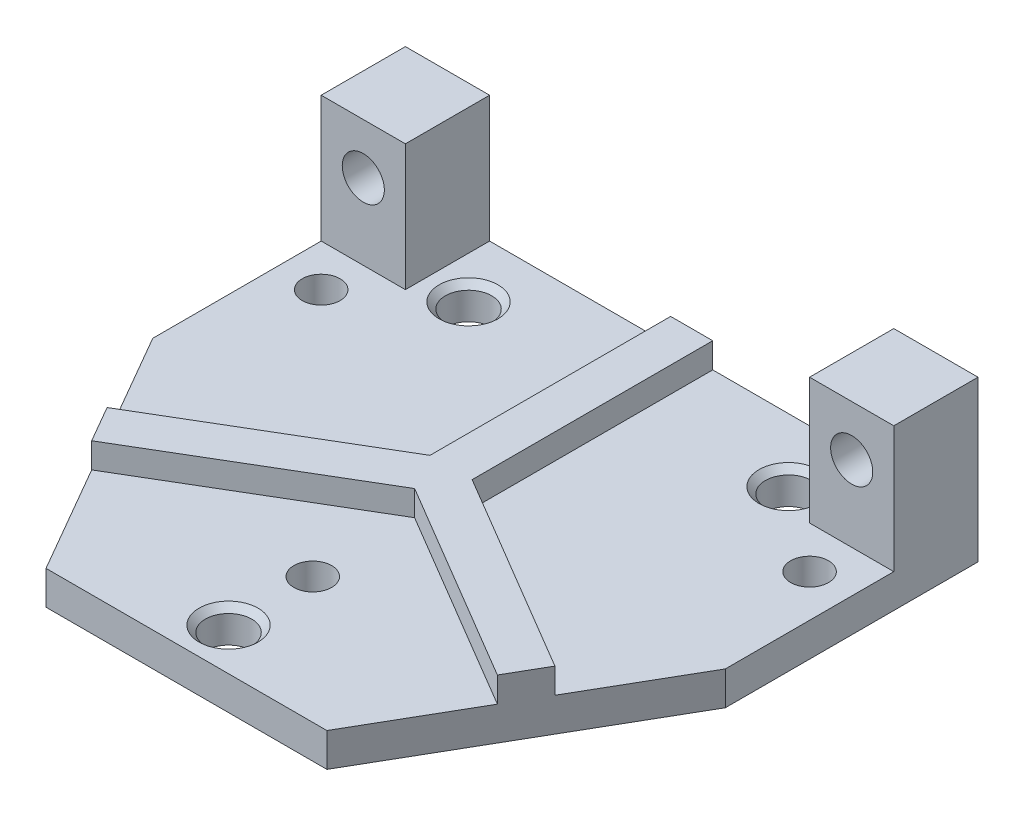
ISO-10303-21;
HEADER;
FILE_DESCRIPTION(('STEP AP214'),'2;1');
FILE_NAME('part.step','',(''),(''),'','','');
FILE_SCHEMA(('AUTOMOTIVE_DESIGN { 1 0 10303 214 1 1 1 1 }'));
ENDSEC;
DATA;
#1=APPLICATION_CONTEXT('core data for automotive mechanical design processes');
#2=APPLICATION_PROTOCOL_DEFINITION('international standard','automotive_design',2000,#1);
#3=PRODUCT_CONTEXT('',#1,'mechanical');
#4=PRODUCT('Part','Part','',(#3));
#5=PRODUCT_RELATED_PRODUCT_CATEGORY('part','',(#4));
#6=PRODUCT_DEFINITION_FORMATION('','',#4);
#7=PRODUCT_DEFINITION_CONTEXT('part definition',#1,'design');
#8=PRODUCT_DEFINITION('design','',#6,#7);
#9=PRODUCT_DEFINITION_SHAPE('','',#8);
#10=(LENGTH_UNIT() NAMED_UNIT(*) SI_UNIT(.MILLI.,.METRE.));
#11=(NAMED_UNIT(*) PLANE_ANGLE_UNIT() SI_UNIT($,.RADIAN.));
#12=(NAMED_UNIT(*) SI_UNIT($,.STERADIAN.) SOLID_ANGLE_UNIT());
#13=UNCERTAINTY_MEASURE_WITH_UNIT(LENGTH_MEASURE(1.E-05),#10,'distance_accuracy_value','');
#14=(GEOMETRIC_REPRESENTATION_CONTEXT(3) GLOBAL_UNCERTAINTY_ASSIGNED_CONTEXT((#13)) GLOBAL_UNIT_ASSIGNED_CONTEXT((#10,
#11,#12)) REPRESENTATION_CONTEXT('',''));
#15=CARTESIAN_POINT('',(0.,0.,0.));
#16=DIRECTION('',(0.,0.,1.));
#17=DIRECTION('',(1.,0.,0.));
#18=AXIS2_PLACEMENT_3D('',#15,#16,#17);
#19=CARTESIAN_POINT('',(0.,4.,0.));
#20=DIRECTION('',(0.,-1.,0.));
#21=DIRECTION('',(0.,0.,-1.));
#22=AXIS2_PLACEMENT_3D('',#19,#20,#21);
#23=PLANE('',#22);
#24=CARTESIAN_POINT('',(19.,4.,-22.5));
#25=DIRECTION('',(0.,-1.,0.));
#26=DIRECTION('',(0.,0.,-1.));
#27=AXIS2_PLACEMENT_3D('',#24,#25,#26);
#28=CIRCLE('',#27,3.5);
#29=CARTESIAN_POINT('',(19.,4.,-26.));
#30=VERTEX_POINT('',#29);
#31=EDGE_CURVE('E11',#30,#30,#28,.T.);
#32=ORIENTED_EDGE('',*,*,#31,.T.);
#33=EDGE_LOOP('',(#32));
#34=FACE_BOUND('',#33,.T.);
#35=CARTESIAN_POINT('',(29.,4.,-15.));
#36=DIRECTION('',(0.,1.,0.));
#37=DIRECTION('',(0.,0.,1.));
#38=AXIS2_PLACEMENT_3D('',#35,#36,#37);
#39=CIRCLE('',#38,2.25);
#40=CARTESIAN_POINT('',(29.,4.,-12.75));
#41=VERTEX_POINT('',#40);
#42=EDGE_CURVE('E315',#41,#41,#39,.T.);
#43=ORIENTED_EDGE('',*,*,#42,.F.);
#44=EDGE_LOOP('',(#43));
#45=FACE_BOUND('',#44,.T.);
#46=DIRECTION('',(0.,0.,1.));
#47=VECTOR('',#46,1.);
#48=CARTESIAN_POINT('',(23.9999999999999,4.,-30.));
#49=LINE('',#48,#47);
#50=CARTESIAN_POINT('',(23.9999999999999,4.,-30.));
#51=VERTEX_POINT('',#50);
#52=CARTESIAN_POINT('',(23.9999999999999,4.,-20.));
#53=VERTEX_POINT('',#52);
#54=EDGE_CURVE('E203',#51,#53,#49,.T.);
#55=ORIENTED_EDGE('',*,*,#54,.F.);
#56=DIRECTION('',(-1.,0.,0.));
#57=VECTOR('',#56,1.);
#58=CARTESIAN_POINT('',(-34.,4.,-30.));
#59=LINE('',#58,#57);
#60=CARTESIAN_POINT('',(2.5,4.,-30.));
#61=VERTEX_POINT('',#60);
#62=EDGE_CURVE('E338',#51,#61,#59,.T.);
#63=ORIENTED_EDGE('',*,*,#62,.T.);
#64=DIRECTION('',(0.,0.,-1.));
#65=VECTOR('',#64,1.);
#66=CARTESIAN_POINT('',(2.5,4.,-1.4252913257079));
#67=LINE('',#66,#65);
#68=CARTESIAN_POINT('',(2.5,4.,-1.4252913257079));
#69=VERTEX_POINT('',#68);
#70=EDGE_CURVE('E277',#69,#61,#67,.T.);
#71=ORIENTED_EDGE('',*,*,#70,.F.);
#72=DIRECTION('',(-0.860531913298751,0.,-0.509396531392186));
#73=VECTOR('',#72,1.);
#74=CARTESIAN_POINT('',(2.5,4.,-1.4252913257079));
#75=LINE('',#74,#73);
#76=CARTESIAN_POINT('',(26.5898200123171,4.,12.834808231897));
#77=VERTEX_POINT('',#76);
#78=EDGE_CURVE('E274',#77,#69,#75,.T.);
#79=ORIENTED_EDGE('',*,*,#78,.F.);
#80=DIRECTION('',(0.499999999999997,0.,-0.86602540378444));
#81=VECTOR('',#80,1.);
#82=CARTESIAN_POINT('',(16.6794919243114,4.,30.));
#83=LINE('',#82,#81);
#84=CARTESIAN_POINT('',(34.,4.,0.));
#85=VERTEX_POINT('',#84);
#86=EDGE_CURVE('E347',#77,#85,#83,.T.);
#87=ORIENTED_EDGE('',*,*,#86,.T.);
#88=DIRECTION('',(0.,0.,-1.));
#89=VECTOR('',#88,1.);
#90=CARTESIAN_POINT('',(34.,4.,0.));
#91=LINE('',#90,#89);
#92=CARTESIAN_POINT('',(34.,4.,-20.));
#93=VERTEX_POINT('',#92);
#94=EDGE_CURVE('E53',#85,#93,#91,.T.);
#95=ORIENTED_EDGE('',*,*,#94,.T.);
#96=DIRECTION('',(1.,0.,0.));
#97=VECTOR('',#96,1.);
#98=CARTESIAN_POINT('',(34.,4.,-20.));
#99=LINE('',#98,#97);
#100=EDGE_CURVE('E48',#53,#93,#99,.T.);
#101=ORIENTED_EDGE('',*,*,#100,.F.);
#102=EDGE_LOOP('',(#55,#63,#71,#79,#87,#95,#101));
#103=FACE_BOUND('',#102,.T.);
#104=ADVANCED_FACE('F33',(#34,#45,#103),#23,.F.);
#105=CARTESIAN_POINT('',(-19.,4.,-22.5));
#106=DIRECTION('',(0.,-1.,0.));
#107=DIRECTION('',(0.,0.,-1.));
#108=AXIS2_PLACEMENT_3D('',#105,#106,#107);
#109=CIRCLE('',#108,3.5);
#110=CARTESIAN_POINT('',(-19.,4.,-26.));
#111=VERTEX_POINT('',#110);
#112=EDGE_CURVE('E387',#111,#111,#109,.T.);
#113=ORIENTED_EDGE('',*,*,#112,.T.);
#114=EDGE_LOOP('',(#113));
#115=FACE_BOUND('',#114,.T.);
#116=CARTESIAN_POINT('',(-29.,4.,-15.));
#117=DIRECTION('',(0.,1.,0.));
#118=DIRECTION('',(0.,0.,1.));
#119=AXIS2_PLACEMENT_3D('',#116,#117,#118);
#120=CIRCLE('',#119,2.25);
#121=CARTESIAN_POINT('',(-29.,4.,-12.75));
#122=VERTEX_POINT('',#121);
#123=EDGE_CURVE('E321',#122,#122,#120,.T.);
#124=ORIENTED_EDGE('',*,*,#123,.F.);
#125=EDGE_LOOP('',(#124));
#126=FACE_BOUND('',#125,.T.);
#127=DIRECTION('',(1.,0.,0.));
#128=VECTOR('',#127,1.);
#129=CARTESIAN_POINT('',(-34.,4.,-20.));
#130=LINE('',#129,#128);
#131=CARTESIAN_POINT('',(-34.,4.,-20.));
#132=VERTEX_POINT('',#131);
#133=CARTESIAN_POINT('',(-24.,4.,-20.));
#134=VERTEX_POINT('',#133);
#135=EDGE_CURVE('E219',#132,#134,#130,.T.);
#136=ORIENTED_EDGE('',*,*,#135,.F.);
#137=DIRECTION('',(0.,0.,1.));
#138=VECTOR('',#137,1.);
#139=CARTESIAN_POINT('',(-34.,4.,0.));
#140=LINE('',#139,#138);
#141=CARTESIAN_POINT('',(-34.,4.,0.));
#142=VERTEX_POINT('',#141);
#143=EDGE_CURVE('E340',#132,#142,#140,.T.);
#144=ORIENTED_EDGE('',*,*,#143,.T.);
#145=DIRECTION('',(0.499999999999999,0.,0.866025403784439));
#146=VECTOR('',#145,1.);
#147=CARTESIAN_POINT('',(-34.,4.,0.));
#148=LINE('',#147,#146);
#149=CARTESIAN_POINT('',(-26.5898200123171,4.,12.834808231897));
#150=VERTEX_POINT('',#149);
#151=EDGE_CURVE('E343',#142,#150,#148,.T.);
#152=ORIENTED_EDGE('',*,*,#151,.T.);
#153=DIRECTION('',(-0.860531913298751,0.,0.509396531392187));
#154=VECTOR('',#153,1.);
#155=CARTESIAN_POINT('',(-26.5898200123171,4.,12.834808231897));
#156=LINE('',#155,#154);
#157=CARTESIAN_POINT('',(-2.5,4.,-1.4252913257079));
#158=VERTEX_POINT('',#157);
#159=EDGE_CURVE('E244',#158,#150,#156,.T.);
#160=ORIENTED_EDGE('',*,*,#159,.F.);
#161=DIRECTION('',(0.,0.,1.));
#162=VECTOR('',#161,1.);
#163=CARTESIAN_POINT('',(-2.5,4.,-1.4252913257079));
#164=LINE('',#163,#162);
#165=CARTESIAN_POINT('',(-2.5,4.,-30.));
#166=VERTEX_POINT('',#165);
#167=EDGE_CURVE('E249',#166,#158,#164,.T.);
#168=ORIENTED_EDGE('',*,*,#167,.F.);
#169=CARTESIAN_POINT('',(-24.,4.,-30.));
#170=VERTEX_POINT('',#169);
#171=EDGE_CURVE('E336',#166,#170,#59,.T.);
#172=ORIENTED_EDGE('',*,*,#171,.T.);
#173=DIRECTION('',(0.,0.,-1.));
#174=VECTOR('',#173,1.);
#175=CARTESIAN_POINT('',(-24.,4.,-30.));
#176=LINE('',#175,#174);
#177=EDGE_CURVE('E224',#134,#170,#176,.T.);
#178=ORIENTED_EDGE('',*,*,#177,.F.);
#179=EDGE_LOOP('',(#136,#144,#152,#160,#168,#172,#178));
#180=FACE_BOUND('',#179,.T.);
#181=ADVANCED_FACE('F405',(#115,#126,#180),#23,.F.);
#182=CARTESIAN_POINT('',(0.,4.,25.));
#183=DIRECTION('',(0.,-1.,0.));
#184=DIRECTION('',(0.,0.,-1.));
#185=AXIS2_PLACEMENT_3D('',#182,#183,#184);
#186=CIRCLE('',#185,3.5);
#187=CARTESIAN_POINT('',(0.,4.,21.5));
#188=VERTEX_POINT('',#187);
#189=EDGE_CURVE('E381',#188,#188,#186,.T.);
#190=ORIENTED_EDGE('',*,*,#189,.T.);
#191=EDGE_LOOP('',(#190));
#192=FACE_BOUND('',#191,.T.);
#193=CARTESIAN_POINT('',(0.,4.,15.));
#194=DIRECTION('',(0.,1.,0.));
#195=DIRECTION('',(0.,0.,1.));
#196=AXIS2_PLACEMENT_3D('',#193,#194,#195);
#197=CIRCLE('',#196,2.25);
#198=CARTESIAN_POINT('',(0.,4.,17.25));
#199=VERTEX_POINT('',#198);
#200=EDGE_CURVE('E309',#199,#199,#197,.T.);
#201=ORIENTED_EDGE('',*,*,#200,.F.);
#202=EDGE_LOOP('',(#201));
#203=FACE_BOUND('',#202,.T.);
#204=DIRECTION('',(0.860531913298751,0.,0.509396531392186));
#205=VECTOR('',#204,1.);
#206=CARTESIAN_POINT('',(0.,4.,2.90517987928714));
#207=LINE('',#206,#205);
#208=CARTESIAN_POINT('',(0.,4.,2.90517987928714));
#209=VERTEX_POINT('',#208);
#210=CARTESIAN_POINT('',(24.0896719119943,4.,17.165191768103));
#211=VERTEX_POINT('',#210);
#212=EDGE_CURVE('E271',#209,#211,#207,.T.);
#213=ORIENTED_EDGE('',*,*,#212,.F.);
#214=DIRECTION('',(0.86053191329875,0.,-0.509396531392187));
#215=VECTOR('',#214,1.);
#216=CARTESIAN_POINT('',(-24.0896719119942,4.,17.165191768103));
#217=LINE('',#216,#215);
#218=CARTESIAN_POINT('',(-24.0896719119942,4.,17.165191768103));
#219=VERTEX_POINT('',#218);
#220=EDGE_CURVE('E268',#219,#209,#217,.T.);
#221=ORIENTED_EDGE('',*,*,#220,.F.);
#222=CARTESIAN_POINT('',(-16.6794919243113,4.,30.));
#223=VERTEX_POINT('',#222);
#224=EDGE_CURVE('E342',#219,#223,#148,.T.);
#225=ORIENTED_EDGE('',*,*,#224,.T.);
#226=DIRECTION('',(1.,0.,0.));
#227=VECTOR('',#226,1.);
#228=CARTESIAN_POINT('',(-16.6794919243113,4.,30.));
#229=LINE('',#228,#227);
#230=CARTESIAN_POINT('',(16.6794919243114,4.,30.));
#231=VERTEX_POINT('',#230);
#232=EDGE_CURVE('E345',#223,#231,#229,.T.);
#233=ORIENTED_EDGE('',*,*,#232,.T.);
#234=EDGE_CURVE('E348',#231,#211,#83,.T.);
#235=ORIENTED_EDGE('',*,*,#234,.T.);
#236=EDGE_LOOP('',(#213,#221,#225,#233,#235));
#237=FACE_BOUND('',#236,.T.);
#238=ADVANCED_FACE('F408',(#192,#203,#237),#23,.F.);
#239=CARTESIAN_POINT('',(0.,0.,0.));
#240=DIRECTION('',(0.,-1.,0.));
#241=DIRECTION('',(0.,0.,-1.));
#242=AXIS2_PLACEMENT_3D('',#239,#240,#241);
#243=PLANE('',#242);
#244=CARTESIAN_POINT('',(29.,0.,-15.));
#245=DIRECTION('',(0.,1.,0.));
#246=DIRECTION('',(0.,0.,1.));
#247=AXIS2_PLACEMENT_3D('',#244,#245,#246);
#248=CIRCLE('',#247,2.25);
#249=CARTESIAN_POINT('',(29.,0.,-12.75));
#250=VERTEX_POINT('',#249);
#251=EDGE_CURVE('E312',#250,#250,#248,.T.);
#252=ORIENTED_EDGE('',*,*,#251,.T.);
#253=EDGE_LOOP('',(#252));
#254=FACE_BOUND('',#253,.T.);
#255=CARTESIAN_POINT('',(0.,0.,25.));
#256=DIRECTION('',(0.,1.,0.));
#257=DIRECTION('',(0.,0.,1.));
#258=AXIS2_PLACEMENT_3D('',#255,#256,#257);
#259=CIRCLE('',#258,2.75);
#260=CARTESIAN_POINT('',(0.,0.,27.75));
#261=VERTEX_POINT('',#260);
#262=EDGE_CURVE('E324',#261,#261,#259,.T.);
#263=ORIENTED_EDGE('',*,*,#262,.T.);
#264=EDGE_LOOP('',(#263));
#265=FACE_BOUND('',#264,.T.);
#266=CARTESIAN_POINT('',(-19.,0.,-22.5));
#267=DIRECTION('',(0.,1.,0.));
#268=DIRECTION('',(0.,0.,1.));
#269=AXIS2_PLACEMENT_3D('',#266,#267,#268);
#270=CIRCLE('',#269,2.75);
#271=CARTESIAN_POINT('',(-19.,0.,-19.75));
#272=VERTEX_POINT('',#271);
#273=EDGE_CURVE('E332',#272,#272,#270,.T.);
#274=ORIENTED_EDGE('',*,*,#273,.T.);
#275=EDGE_LOOP('',(#274));
#276=FACE_BOUND('',#275,.T.);
#277=DIRECTION('',(0.,0.,-1.));
#278=VECTOR('',#277,1.);
#279=CARTESIAN_POINT('',(34.,0.,0.));
#280=LINE('',#279,#278);
#281=CARTESIAN_POINT('',(34.,0.,0.));
#282=VERTEX_POINT('',#281);
#283=CARTESIAN_POINT('',(34.,0.,-30.));
#284=VERTEX_POINT('',#283);
#285=EDGE_CURVE('E184',#282,#284,#280,.T.);
#286=ORIENTED_EDGE('',*,*,#285,.F.);
#287=DIRECTION('',(0.499999999999997,0.,-0.86602540378444));
#288=VECTOR('',#287,1.);
#289=CARTESIAN_POINT('',(16.6794919243114,0.,30.));
#290=LINE('',#289,#288);
#291=CARTESIAN_POINT('',(16.6794919243114,0.,30.));
#292=VERTEX_POINT('',#291);
#293=EDGE_CURVE('E337',#292,#282,#290,.T.);
#294=ORIENTED_EDGE('',*,*,#293,.F.);
#295=DIRECTION('',(1.,0.,0.));
#296=VECTOR('',#295,1.);
#297=CARTESIAN_POINT('',(-16.6794919243113,0.,30.));
#298=LINE('',#297,#296);
#299=CARTESIAN_POINT('',(-16.6794919243113,0.,30.));
#300=VERTEX_POINT('',#299);
#301=EDGE_CURVE('E358',#300,#292,#298,.T.);
#302=ORIENTED_EDGE('',*,*,#301,.F.);
#303=DIRECTION('',(0.499999999999999,0.,0.866025403784439));
#304=VECTOR('',#303,1.);
#305=CARTESIAN_POINT('',(-34.,0.,0.));
#306=LINE('',#305,#304);
#307=CARTESIAN_POINT('',(-34.,0.,0.));
#308=VERTEX_POINT('',#307);
#309=EDGE_CURVE('E356',#308,#300,#306,.T.);
#310=ORIENTED_EDGE('',*,*,#309,.F.);
#311=DIRECTION('',(0.,0.,1.));
#312=VECTOR('',#311,1.);
#313=CARTESIAN_POINT('',(-34.,0.,0.));
#314=LINE('',#313,#312);
#315=CARTESIAN_POINT('',(-34.,0.,-30.));
#316=VERTEX_POINT('',#315);
#317=EDGE_CURVE('E354',#316,#308,#314,.T.);
#318=ORIENTED_EDGE('',*,*,#317,.F.);
#319=DIRECTION('',(-1.,0.,0.));
#320=VECTOR('',#319,1.);
#321=CARTESIAN_POINT('',(-34.,0.,-30.));
#322=LINE('',#321,#320);
#323=EDGE_CURVE('E352',#284,#316,#322,.T.);
#324=ORIENTED_EDGE('',*,*,#323,.F.);
#325=EDGE_LOOP('',(#286,#294,#302,#310,#318,#324));
#326=FACE_BOUND('',#325,.T.);
#327=CARTESIAN_POINT('',(19.,0.,-22.5));
#328=DIRECTION('',(0.,1.,0.));
#329=DIRECTION('',(0.,0.,1.));
#330=AXIS2_PLACEMENT_3D('',#327,#328,#329);
#331=CIRCLE('',#330,2.75);
#332=CARTESIAN_POINT('',(19.,0.,-19.75));
#333=VERTEX_POINT('',#332);
#334=EDGE_CURVE('E329',#333,#333,#331,.T.);
#335=ORIENTED_EDGE('',*,*,#334,.T.);
#336=EDGE_LOOP('',(#335));
#337=FACE_BOUND('',#336,.T.);
#338=CARTESIAN_POINT('',(-29.,0.,-15.));
#339=DIRECTION('',(0.,1.,0.));
#340=DIRECTION('',(0.,0.,1.));
#341=AXIS2_PLACEMENT_3D('',#338,#339,#340);
#342=CIRCLE('',#341,2.25);
#343=CARTESIAN_POINT('',(-29.,0.,-12.75));
#344=VERTEX_POINT('',#343);
#345=EDGE_CURVE('E318',#344,#344,#342,.T.);
#346=ORIENTED_EDGE('',*,*,#345,.T.);
#347=EDGE_LOOP('',(#346));
#348=FACE_BOUND('',#347,.T.);
#349=CARTESIAN_POINT('',(0.,0.,15.));
#350=DIRECTION('',(0.,1.,0.));
#351=DIRECTION('',(0.,0.,1.));
#352=AXIS2_PLACEMENT_3D('',#349,#350,#351);
#353=CIRCLE('',#352,2.25);
#354=CARTESIAN_POINT('',(0.,0.,17.25));
#355=VERTEX_POINT('',#354);
#356=EDGE_CURVE('E308',#355,#355,#353,.T.);
#357=ORIENTED_EDGE('',*,*,#356,.T.);
#358=EDGE_LOOP('',(#357));
#359=FACE_BOUND('',#358,.T.);
#360=ADVANCED_FACE('F417',(#254,#265,#276,#326,#337,#348,#359),#243,.T.);
#361=CARTESIAN_POINT('',(34.,4.,0.));
#362=DIRECTION('',(-1.,0.,0.));
#363=DIRECTION('',(0.,0.,1.));
#364=AXIS2_PLACEMENT_3D('',#361,#362,#363);
#365=PLANE('',#364);
#366=ORIENTED_EDGE('',*,*,#285,.T.);
#367=DIRECTION('',(0.,-1.,0.));
#368=VECTOR('',#367,1.);
#369=CARTESIAN_POINT('',(34.,4.,-30.));
#370=LINE('',#369,#368);
#371=CARTESIAN_POINT('',(34.,19.,-30.));
#372=VERTEX_POINT('',#371);
#373=EDGE_CURVE('E176',#372,#284,#370,.T.);
#374=ORIENTED_EDGE('',*,*,#373,.F.);
#375=DIRECTION('',(0.,0.,-1.));
#376=VECTOR('',#375,1.);
#377=CARTESIAN_POINT('',(34.,19.,-30.));
#378=LINE('',#377,#376);
#379=CARTESIAN_POINT('',(34.,19.,-20.));
#380=VERTEX_POINT('',#379);
#381=EDGE_CURVE('E181',#380,#372,#378,.T.);
#382=ORIENTED_EDGE('',*,*,#381,.F.);
#383=DIRECTION('',(0.,-1.,0.));
#384=VECTOR('',#383,1.);
#385=CARTESIAN_POINT('',(34.,19.,-20.));
#386=LINE('',#385,#384);
#387=EDGE_CURVE('E211',#380,#93,#386,.T.);
#388=ORIENTED_EDGE('',*,*,#387,.T.);
#389=ORIENTED_EDGE('',*,*,#94,.F.);
#390=DIRECTION('',(0.,-1.,0.));
#391=VECTOR('',#390,1.);
#392=CARTESIAN_POINT('',(34.,4.,0.));
#393=LINE('',#392,#391);
#394=EDGE_CURVE('E350',#85,#282,#393,.T.);
#395=ORIENTED_EDGE('',*,*,#394,.T.);
#396=EDGE_LOOP('',(#366,#374,#382,#388,#389,#395));
#397=FACE_BOUND('',#396,.T.);
#398=ADVANCED_FACE('F178',(#397),#365,.F.);
#399=CARTESIAN_POINT('',(-34.,4.,-30.));
#400=DIRECTION('',(0.,0.,1.));
#401=DIRECTION('',(1.,0.,0.));
#402=AXIS2_PLACEMENT_3D('',#399,#400,#401);
#403=PLANE('',#402);
#404=CARTESIAN_POINT('',(29.,13.,-30.));
#405=DIRECTION('',(0.,0.,-1.));
#406=DIRECTION('',(-1.,0.,0.));
#407=AXIS2_PLACEMENT_3D('',#404,#405,#406);
#408=CIRCLE('',#407,2.5);
#409=CARTESIAN_POINT('',(26.5,13.,-30.));
#410=VERTEX_POINT('',#409);
#411=EDGE_CURVE('E376',#410,#410,#408,.T.);
#412=ORIENTED_EDGE('',*,*,#411,.F.);
#413=EDGE_LOOP('',(#412));
#414=FACE_BOUND('',#413,.T.);
#415=CARTESIAN_POINT('',(-29.,13.,-30.));
#416=DIRECTION('',(0.,0.,-1.));
#417=DIRECTION('',(-1.,0.,0.));
#418=AXIS2_PLACEMENT_3D('',#415,#416,#417);
#419=CIRCLE('',#418,2.49999999999999);
#420=CARTESIAN_POINT('',(-31.5,13.,-30.));
#421=VERTEX_POINT('',#420);
#422=EDGE_CURVE('E206',#421,#421,#419,.T.);
#423=ORIENTED_EDGE('',*,*,#422,.F.);
#424=EDGE_LOOP('',(#423));
#425=FACE_BOUND('',#424,.T.);
#426=ORIENTED_EDGE('',*,*,#323,.T.);
#427=DIRECTION('',(0.,-1.,0.));
#428=VECTOR('',#427,1.);
#429=CARTESIAN_POINT('',(-34.,4.,-30.));
#430=LINE('',#429,#428);
#431=CARTESIAN_POINT('',(-34.,19.,-30.));
#432=VERTEX_POINT('',#431);
#433=EDGE_CURVE('E187',#432,#316,#430,.T.);
#434=ORIENTED_EDGE('',*,*,#433,.F.);
#435=DIRECTION('',(-1.,0.,0.));
#436=VECTOR('',#435,1.);
#437=CARTESIAN_POINT('',(-34.,19.,-30.));
#438=LINE('',#437,#436);
#439=CARTESIAN_POINT('',(-24.,19.,-30.));
#440=VERTEX_POINT('',#439);
#441=EDGE_CURVE('E228',#440,#432,#438,.T.);
#442=ORIENTED_EDGE('',*,*,#441,.F.);
#443=DIRECTION('',(0.,-1.,0.));
#444=VECTOR('',#443,1.);
#445=CARTESIAN_POINT('',(-24.,19.,-30.));
#446=LINE('',#445,#444);
#447=EDGE_CURVE('E231',#440,#170,#446,.T.);
#448=ORIENTED_EDGE('',*,*,#447,.T.);
#449=ORIENTED_EDGE('',*,*,#171,.F.);
#450=DIRECTION('',(0.,-1.,0.));
#451=VECTOR('',#450,1.);
#452=CARTESIAN_POINT('',(-2.5,7.,-30.));
#453=LINE('',#452,#451);
#454=CARTESIAN_POINT('',(-2.5,7.,-30.));
#455=VERTEX_POINT('',#454);
#456=EDGE_CURVE('E284',#455,#166,#453,.T.);
#457=ORIENTED_EDGE('',*,*,#456,.F.);
#458=DIRECTION('',(-1.,0.,0.));
#459=VECTOR('',#458,1.);
#460=CARTESIAN_POINT('',(-2.5,7.,-30.));
#461=LINE('',#460,#459);
#462=CARTESIAN_POINT('',(2.5,7.,-30.));
#463=VERTEX_POINT('',#462);
#464=EDGE_CURVE('E261',#463,#455,#461,.T.);
#465=ORIENTED_EDGE('',*,*,#464,.F.);
#466=DIRECTION('',(0.,-1.,0.));
#467=VECTOR('',#466,1.);
#468=CARTESIAN_POINT('',(2.5,7.,-30.));
#469=LINE('',#468,#467);
#470=EDGE_CURVE('E287',#463,#61,#469,.T.);
#471=ORIENTED_EDGE('',*,*,#470,.T.);
#472=ORIENTED_EDGE('',*,*,#62,.F.);
#473=DIRECTION('',(0.,-1.,0.));
#474=VECTOR('',#473,1.);
#475=CARTESIAN_POINT('',(23.9999999999999,19.,-30.));
#476=LINE('',#475,#474);
#477=CARTESIAN_POINT('',(23.9999999999999,19.,-30.));
#478=VERTEX_POINT('',#477);
#479=EDGE_CURVE('E193',#478,#51,#476,.T.);
#480=ORIENTED_EDGE('',*,*,#479,.F.);
#481=DIRECTION('',(-1.,0.,0.));
#482=VECTOR('',#481,1.);
#483=CARTESIAN_POINT('',(34.,19.,-30.));
#484=LINE('',#483,#482);
#485=EDGE_CURVE('E190',#372,#478,#484,.T.);
#486=ORIENTED_EDGE('',*,*,#485,.F.);
#487=ORIENTED_EDGE('',*,*,#373,.T.);
#488=EDGE_LOOP('',(#426,#434,#442,#448,#449,#457,#465,#471,#472,#480,#486,#487));
#489=FACE_BOUND('',#488,.T.);
#490=ADVANCED_FACE('F191',(#414,#425,#489),#403,.F.);
#491=CARTESIAN_POINT('',(-34.,4.,0.));
#492=DIRECTION('',(1.,0.,0.));
#493=DIRECTION('',(0.,0.,-1.));
#494=AXIS2_PLACEMENT_3D('',#491,#492,#493);
#495=PLANE('',#494);
#496=ORIENTED_EDGE('',*,*,#317,.T.);
#497=DIRECTION('',(0.,-1.,0.));
#498=VECTOR('',#497,1.);
#499=CARTESIAN_POINT('',(-34.,4.,0.));
#500=LINE('',#499,#498);
#501=EDGE_CURVE('E368',#142,#308,#500,.T.);
#502=ORIENTED_EDGE('',*,*,#501,.F.);
#503=ORIENTED_EDGE('',*,*,#143,.F.);
#504=DIRECTION('',(0.,-1.,0.));
#505=VECTOR('',#504,1.);
#506=CARTESIAN_POINT('',(-34.,19.,-20.));
#507=LINE('',#506,#505);
#508=CARTESIAN_POINT('',(-34.,19.,-20.));
#509=VERTEX_POINT('',#508);
#510=EDGE_CURVE('E241',#509,#132,#507,.T.);
#511=ORIENTED_EDGE('',*,*,#510,.F.);
#512=DIRECTION('',(0.,0.,1.));
#513=VECTOR('',#512,1.);
#514=CARTESIAN_POINT('',(-34.,19.,-30.));
#515=LINE('',#514,#513);
#516=EDGE_CURVE('E220',#432,#509,#515,.T.);
#517=ORIENTED_EDGE('',*,*,#516,.F.);
#518=ORIENTED_EDGE('',*,*,#433,.T.);
#519=EDGE_LOOP('',(#496,#502,#503,#511,#517,#518));
#520=FACE_BOUND('',#519,.T.);
#521=ADVANCED_FACE('F481',(#520),#495,.F.);
#522=CARTESIAN_POINT('',(-34.,4.,0.));
#523=DIRECTION('',(0.866025403784439,0.,-0.499999999999999));
#524=DIRECTION('',(-0.499999999999999,0.,-0.866025403784439));
#525=AXIS2_PLACEMENT_3D('',#522,#523,#524);
#526=PLANE('',#525);
#527=ORIENTED_EDGE('',*,*,#309,.T.);
#528=DIRECTION('',(0.,-1.,0.));
#529=VECTOR('',#528,1.);
#530=CARTESIAN_POINT('',(-16.6794919243113,4.,30.));
#531=LINE('',#530,#529);
#532=EDGE_CURVE('E365',#223,#300,#531,.T.);
#533=ORIENTED_EDGE('',*,*,#532,.F.);
#534=ORIENTED_EDGE('',*,*,#224,.F.);
#535=DIRECTION('',(0.,-1.,0.));
#536=VECTOR('',#535,1.);
#537=CARTESIAN_POINT('',(-24.0896719119942,7.,17.165191768103));
#538=LINE('',#537,#536);
#539=CARTESIAN_POINT('',(-24.0896719119942,7.,17.165191768103));
#540=VERTEX_POINT('',#539);
#541=EDGE_CURVE('E302',#540,#219,#538,.T.);
#542=ORIENTED_EDGE('',*,*,#541,.F.);
#543=DIRECTION('',(0.499999999999999,0.,0.866025403784439));
#544=VECTOR('',#543,1.);
#545=CARTESIAN_POINT('',(-26.5898200123171,7.,12.834808231897));
#546=LINE('',#545,#544);
#547=CARTESIAN_POINT('',(-26.5898200123171,7.,12.834808231897));
#548=VERTEX_POINT('',#547);
#549=EDGE_CURVE('E248',#548,#540,#546,.T.);
#550=ORIENTED_EDGE('',*,*,#549,.F.);
#551=DIRECTION('',(0.,-1.,0.));
#552=VECTOR('',#551,1.);
#553=CARTESIAN_POINT('',(-26.5898200123171,7.,12.834808231897));
#554=LINE('',#553,#552);
#555=EDGE_CURVE('E305',#548,#150,#554,.T.);
#556=ORIENTED_EDGE('',*,*,#555,.T.);
#557=ORIENTED_EDGE('',*,*,#151,.F.);
#558=ORIENTED_EDGE('',*,*,#501,.T.);
#559=EDGE_LOOP('',(#527,#533,#534,#542,#550,#556,#557,#558));
#560=FACE_BOUND('',#559,.T.);
#561=ADVANCED_FACE('F445',(#560),#526,.F.);
#562=CARTESIAN_POINT('',(-16.6794919243113,4.,30.));
#563=DIRECTION('',(0.,0.,-1.));
#564=DIRECTION('',(-1.,0.,0.));
#565=AXIS2_PLACEMENT_3D('',#562,#563,#564);
#566=PLANE('',#565);
#567=ORIENTED_EDGE('',*,*,#301,.T.);
#568=DIRECTION('',(0.,-1.,0.));
#569=VECTOR('',#568,1.);
#570=CARTESIAN_POINT('',(16.6794919243114,4.,30.));
#571=LINE('',#570,#569);
#572=EDGE_CURVE('E362',#231,#292,#571,.T.);
#573=ORIENTED_EDGE('',*,*,#572,.F.);
#574=ORIENTED_EDGE('',*,*,#232,.F.);
#575=ORIENTED_EDGE('',*,*,#532,.T.);
#576=EDGE_LOOP('',(#567,#573,#574,#575));
#577=FACE_BOUND('',#576,.T.);
#578=ADVANCED_FACE('F450',(#577),#566,.F.);
#579=CARTESIAN_POINT('',(16.6794919243114,4.,30.));
#580=DIRECTION('',(-0.86602540378444,0.,-0.499999999999997));
#581=DIRECTION('',(-0.499999999999997,0.,0.86602540378444));
#582=AXIS2_PLACEMENT_3D('',#579,#580,#581);
#583=PLANE('',#582);
#584=ORIENTED_EDGE('',*,*,#293,.T.);
#585=ORIENTED_EDGE('',*,*,#394,.F.);
#586=ORIENTED_EDGE('',*,*,#86,.F.);
#587=DIRECTION('',(0.,-1.,0.));
#588=VECTOR('',#587,1.);
#589=CARTESIAN_POINT('',(26.5898200123171,7.,12.834808231897));
#590=LINE('',#589,#588);
#591=CARTESIAN_POINT('',(26.5898200123171,7.,12.834808231897));
#592=VERTEX_POINT('',#591);
#593=EDGE_CURVE('E293',#592,#77,#590,.T.);
#594=ORIENTED_EDGE('',*,*,#593,.F.);
#595=DIRECTION('',(0.499999999999997,0.,-0.866025403784441));
#596=VECTOR('',#595,1.);
#597=CARTESIAN_POINT('',(24.0896719119943,7.,17.165191768103));
#598=LINE('',#597,#596);
#599=CARTESIAN_POINT('',(24.0896719119943,7.,17.165191768103));
#600=VERTEX_POINT('',#599);
#601=EDGE_CURVE('E255',#600,#592,#598,.T.);
#602=ORIENTED_EDGE('',*,*,#601,.F.);
#603=DIRECTION('',(0.,-1.,0.));
#604=VECTOR('',#603,1.);
#605=CARTESIAN_POINT('',(24.0896719119943,7.,17.165191768103));
#606=LINE('',#605,#604);
#607=EDGE_CURVE('E296',#600,#211,#606,.T.);
#608=ORIENTED_EDGE('',*,*,#607,.T.);
#609=ORIENTED_EDGE('',*,*,#234,.F.);
#610=ORIENTED_EDGE('',*,*,#572,.T.);
#611=EDGE_LOOP('',(#584,#585,#586,#594,#602,#608,#609,#610));
#612=FACE_BOUND('',#611,.T.);
#613=ADVANCED_FACE('F454',(#612),#583,.F.);
#614=CARTESIAN_POINT('',(-19.,4.,-22.5));
#615=DIRECTION('',(0.,-1.,0.));
#616=DIRECTION('',(0.,0.,-1.));
#617=AXIS2_PLACEMENT_3D('',#614,#615,#616);
#618=CYLINDRICAL_SURFACE('',#617,2.75);
#619=CARTESIAN_POINT('',(-19.,3.25,-22.5));
#620=DIRECTION('',(0.,-1.,0.));
#621=DIRECTION('',(0.,0.,-1.));
#622=AXIS2_PLACEMENT_3D('',#619,#620,#621);
#623=CIRCLE('',#622,2.75);
#624=CARTESIAN_POINT('',(-19.,3.25,-25.25));
#625=VERTEX_POINT('',#624);
#626=EDGE_CURVE('E384',#625,#625,#623,.F.);
#627=ORIENTED_EDGE('',*,*,#626,.T.);
#628=EDGE_LOOP('',(#627));
#629=FACE_BOUND('',#628,.T.);
#630=ORIENTED_EDGE('',*,*,#273,.F.);
#631=EDGE_LOOP('',(#630));
#632=FACE_BOUND('',#631,.T.);
#633=ADVANCED_FACE('F543',(#629,#632),#618,.F.);
#634=CARTESIAN_POINT('',(19.,4.,-22.5));
#635=DIRECTION('',(0.,-1.,0.));
#636=DIRECTION('',(0.,0.,-1.));
#637=AXIS2_PLACEMENT_3D('',#634,#635,#636);
#638=CYLINDRICAL_SURFACE('',#637,2.75);
#639=CARTESIAN_POINT('',(19.,3.25,-22.5));
#640=DIRECTION('',(0.,-1.,0.));
#641=DIRECTION('',(0.,0.,-1.));
#642=AXIS2_PLACEMENT_3D('',#639,#640,#641);
#643=CIRCLE('',#642,2.75);
#644=CARTESIAN_POINT('',(19.,3.25,-25.25));
#645=VERTEX_POINT('',#644);
#646=EDGE_CURVE('E41',#645,#645,#643,.F.);
#647=ORIENTED_EDGE('',*,*,#646,.T.);
#648=EDGE_LOOP('',(#647));
#649=FACE_BOUND('',#648,.T.);
#650=ORIENTED_EDGE('',*,*,#334,.F.);
#651=EDGE_LOOP('',(#650));
#652=FACE_BOUND('',#651,.T.);
#653=ADVANCED_FACE('F392',(#649,#652),#638,.F.);
#654=CARTESIAN_POINT('',(0.,4.,25.));
#655=DIRECTION('',(0.,-1.,0.));
#656=DIRECTION('',(0.,0.,-1.));
#657=AXIS2_PLACEMENT_3D('',#654,#655,#656);
#658=CYLINDRICAL_SURFACE('',#657,2.75);
#659=CARTESIAN_POINT('',(0.,3.25,25.));
#660=DIRECTION('',(0.,-1.,0.));
#661=DIRECTION('',(0.,0.,-1.));
#662=AXIS2_PLACEMENT_3D('',#659,#660,#661);
#663=CIRCLE('',#662,2.75);
#664=CARTESIAN_POINT('',(0.,3.25,22.25));
#665=VERTEX_POINT('',#664);
#666=EDGE_CURVE('E186',#665,#665,#663,.F.);
#667=ORIENTED_EDGE('',*,*,#666,.T.);
#668=EDGE_LOOP('',(#667));
#669=FACE_BOUND('',#668,.T.);
#670=ORIENTED_EDGE('',*,*,#262,.F.);
#671=EDGE_LOOP('',(#670));
#672=FACE_BOUND('',#671,.T.);
#673=ADVANCED_FACE('F537',(#669,#672),#658,.F.);
#674=CARTESIAN_POINT('',(-29.,4.,-15.));
#675=DIRECTION('',(0.,-1.,0.));
#676=DIRECTION('',(0.,0.,-1.));
#677=AXIS2_PLACEMENT_3D('',#674,#675,#676);
#678=CYLINDRICAL_SURFACE('',#677,2.25);
#679=ORIENTED_EDGE('',*,*,#123,.T.);
#680=EDGE_LOOP('',(#679));
#681=FACE_BOUND('',#680,.T.);
#682=ORIENTED_EDGE('',*,*,#345,.F.);
#683=EDGE_LOOP('',(#682));
#684=FACE_BOUND('',#683,.T.);
#685=ADVANCED_FACE('F533',(#681,#684),#678,.F.);
#686=CARTESIAN_POINT('',(29.,4.,-15.));
#687=DIRECTION('',(0.,-1.,0.));
#688=DIRECTION('',(0.,0.,-1.));
#689=AXIS2_PLACEMENT_3D('',#686,#687,#688);
#690=CYLINDRICAL_SURFACE('',#689,2.25);
#691=ORIENTED_EDGE('',*,*,#42,.T.);
#692=EDGE_LOOP('',(#691));
#693=FACE_BOUND('',#692,.T.);
#694=ORIENTED_EDGE('',*,*,#251,.F.);
#695=EDGE_LOOP('',(#694));
#696=FACE_BOUND('',#695,.T.);
#697=ADVANCED_FACE('F529',(#693,#696),#690,.F.);
#698=CARTESIAN_POINT('',(0.,4.,15.));
#699=DIRECTION('',(0.,-1.,0.));
#700=DIRECTION('',(0.,0.,-1.));
#701=AXIS2_PLACEMENT_3D('',#698,#699,#700);
#702=CYLINDRICAL_SURFACE('',#701,2.25);
#703=ORIENTED_EDGE('',*,*,#200,.T.);
#704=EDGE_LOOP('',(#703));
#705=FACE_BOUND('',#704,.T.);
#706=ORIENTED_EDGE('',*,*,#356,.F.);
#707=EDGE_LOOP('',(#706));
#708=FACE_BOUND('',#707,.T.);
#709=ADVANCED_FACE('F526',(#705,#708),#702,.F.);
#710=CARTESIAN_POINT('',(-26.5898200123171,7.,12.834808231897));
#711=DIRECTION('',(0.509396531392187,0.,0.86053191329875));
#712=DIRECTION('',(0.860531913298751,0.,-0.509396531392187));
#713=AXIS2_PLACEMENT_3D('',#710,#711,#712);
#714=PLANE('',#713);
#715=ORIENTED_EDGE('',*,*,#159,.T.);
#716=ORIENTED_EDGE('',*,*,#555,.F.);
#717=DIRECTION('',(-0.860531913298751,0.,0.509396531392187));
#718=VECTOR('',#717,1.);
#719=CARTESIAN_POINT('',(-26.5898200123171,7.,12.834808231897));
#720=LINE('',#719,#718);
#721=CARTESIAN_POINT('',(-2.5,7.,-1.4252913257079));
#722=VERTEX_POINT('',#721);
#723=EDGE_CURVE('E245',#722,#548,#720,.T.);
#724=ORIENTED_EDGE('',*,*,#723,.F.);
#725=DIRECTION('',(0.,-1.,0.));
#726=VECTOR('',#725,1.);
#727=CARTESIAN_POINT('',(-2.5,7.,-1.4252913257079));
#728=LINE('',#727,#726);
#729=EDGE_CURVE('E265',#722,#158,#728,.T.);
#730=ORIENTED_EDGE('',*,*,#729,.T.);
#731=EDGE_LOOP('',(#715,#716,#724,#730));
#732=FACE_BOUND('',#731,.T.);
#733=ADVANCED_FACE('F473',(#732),#714,.F.);
#734=CARTESIAN_POINT('',(-24.0896719119942,7.,17.165191768103));
#735=DIRECTION('',(-0.509396531392187,0.,-0.860531913298751));
#736=DIRECTION('',(-0.860531913298751,0.,0.509396531392187));
#737=AXIS2_PLACEMENT_3D('',#734,#735,#736);
#738=PLANE('',#737);
#739=ORIENTED_EDGE('',*,*,#220,.T.);
#740=DIRECTION('',(0.,-1.,0.));
#741=VECTOR('',#740,1.);
#742=CARTESIAN_POINT('',(0.,7.,2.90517987928714));
#743=LINE('',#742,#741);
#744=CARTESIAN_POINT('',(0.,7.,2.90517987928714));
#745=VERTEX_POINT('',#744);
#746=EDGE_CURVE('E299',#745,#209,#743,.T.);
#747=ORIENTED_EDGE('',*,*,#746,.F.);
#748=DIRECTION('',(0.86053191329875,0.,-0.509396531392187));
#749=VECTOR('',#748,1.);
#750=CARTESIAN_POINT('',(-24.0896719119942,7.,17.165191768103));
#751=LINE('',#750,#749);
#752=EDGE_CURVE('E251',#540,#745,#751,.T.);
#753=ORIENTED_EDGE('',*,*,#752,.F.);
#754=ORIENTED_EDGE('',*,*,#541,.T.);
#755=EDGE_LOOP('',(#739,#747,#753,#754));
#756=FACE_BOUND('',#755,.T.);
#757=ADVANCED_FACE('F433',(#756),#738,.F.);
#758=CARTESIAN_POINT('',(0.,7.,2.90517987928714));
#759=DIRECTION('',(0.509396531392186,0.,-0.860531913298751));
#760=DIRECTION('',(-0.860531913298751,0.,-0.509396531392186));
#761=AXIS2_PLACEMENT_3D('',#758,#759,#760);
#762=PLANE('',#761);
#763=ORIENTED_EDGE('',*,*,#212,.T.);
#764=ORIENTED_EDGE('',*,*,#607,.F.);
#765=DIRECTION('',(0.860531913298751,0.,0.509396531392186));
#766=VECTOR('',#765,1.);
#767=CARTESIAN_POINT('',(0.,7.,2.90517987928714));
#768=LINE('',#767,#766);
#769=EDGE_CURVE('E253',#745,#600,#768,.T.);
#770=ORIENTED_EDGE('',*,*,#769,.F.);
#771=ORIENTED_EDGE('',*,*,#746,.T.);
#772=EDGE_LOOP('',(#763,#764,#770,#771));
#773=FACE_BOUND('',#772,.T.);
#774=ADVANCED_FACE('F437',(#773),#762,.F.);
#775=CARTESIAN_POINT('',(2.5,7.,-1.4252913257079));
#776=DIRECTION('',(-0.509396531392186,0.,0.860531913298751));
#777=DIRECTION('',(0.860531913298751,0.,0.509396531392186));
#778=AXIS2_PLACEMENT_3D('',#775,#776,#777);
#779=PLANE('',#778);
#780=ORIENTED_EDGE('',*,*,#78,.T.);
#781=DIRECTION('',(0.,-1.,0.));
#782=VECTOR('',#781,1.);
#783=CARTESIAN_POINT('',(2.5,7.,-1.4252913257079));
#784=LINE('',#783,#782);
#785=CARTESIAN_POINT('',(2.5,7.,-1.4252913257079));
#786=VERTEX_POINT('',#785);
#787=EDGE_CURVE('E290',#786,#69,#784,.T.);
#788=ORIENTED_EDGE('',*,*,#787,.F.);
#789=DIRECTION('',(-0.860531913298751,0.,-0.509396531392186));
#790=VECTOR('',#789,1.);
#791=CARTESIAN_POINT('',(2.5,7.,-1.4252913257079));
#792=LINE('',#791,#790);
#793=EDGE_CURVE('E257',#592,#786,#792,.T.);
#794=ORIENTED_EDGE('',*,*,#793,.F.);
#795=ORIENTED_EDGE('',*,*,#593,.T.);
#796=EDGE_LOOP('',(#780,#788,#794,#795));
#797=FACE_BOUND('',#796,.T.);
#798=ADVANCED_FACE('F460',(#797),#779,.F.);
#799=CARTESIAN_POINT('',(2.5,7.,-1.4252913257079));
#800=DIRECTION('',(-1.,0.,0.));
#801=DIRECTION('',(0.,0.,1.));
#802=AXIS2_PLACEMENT_3D('',#799,#800,#801);
#803=PLANE('',#802);
#804=ORIENTED_EDGE('',*,*,#70,.T.);
#805=ORIENTED_EDGE('',*,*,#470,.F.);
#806=DIRECTION('',(0.,0.,-1.));
#807=VECTOR('',#806,1.);
#808=CARTESIAN_POINT('',(2.5,7.,-1.4252913257079));
#809=LINE('',#808,#807);
#810=EDGE_CURVE('E259',#786,#463,#809,.T.);
#811=ORIENTED_EDGE('',*,*,#810,.F.);
#812=ORIENTED_EDGE('',*,*,#787,.T.);
#813=EDGE_LOOP('',(#804,#805,#811,#812));
#814=FACE_BOUND('',#813,.T.);
#815=ADVANCED_FACE('F466',(#814),#803,.F.);
#816=CARTESIAN_POINT('',(-2.5,7.,-1.4252913257079));
#817=DIRECTION('',(1.,0.,0.));
#818=DIRECTION('',(0.,0.,-1.));
#819=AXIS2_PLACEMENT_3D('',#816,#817,#818);
#820=PLANE('',#819);
#821=ORIENTED_EDGE('',*,*,#167,.T.);
#822=ORIENTED_EDGE('',*,*,#729,.F.);
#823=DIRECTION('',(0.,0.,1.));
#824=VECTOR('',#823,1.);
#825=CARTESIAN_POINT('',(-2.5,7.,-1.4252913257079));
#826=LINE('',#825,#824);
#827=EDGE_CURVE('E263',#455,#722,#826,.T.);
#828=ORIENTED_EDGE('',*,*,#827,.F.);
#829=ORIENTED_EDGE('',*,*,#456,.T.);
#830=EDGE_LOOP('',(#821,#822,#828,#829));
#831=FACE_BOUND('',#830,.T.);
#832=ADVANCED_FACE('F471',(#831),#820,.F.);
#833=CARTESIAN_POINT('',(0.,7.,0.));
#834=DIRECTION('',(0.,-1.,0.));
#835=DIRECTION('',(0.,0.,-1.));
#836=AXIS2_PLACEMENT_3D('',#833,#834,#835);
#837=PLANE('',#836);
#838=ORIENTED_EDGE('',*,*,#723,.T.);
#839=ORIENTED_EDGE('',*,*,#549,.T.);
#840=ORIENTED_EDGE('',*,*,#752,.T.);
#841=ORIENTED_EDGE('',*,*,#769,.T.);
#842=ORIENTED_EDGE('',*,*,#601,.T.);
#843=ORIENTED_EDGE('',*,*,#793,.T.);
#844=ORIENTED_EDGE('',*,*,#810,.T.);
#845=ORIENTED_EDGE('',*,*,#464,.T.);
#846=ORIENTED_EDGE('',*,*,#827,.T.);
#847=EDGE_LOOP('',(#838,#839,#840,#841,#842,#843,#844,#845,#846));
#848=FACE_BOUND('',#847,.T.);
#849=ADVANCED_FACE('F440',(#848),#837,.F.);
#850=CARTESIAN_POINT('',(-34.,19.,-20.));
#851=DIRECTION('',(0.,0.,-1.));
#852=DIRECTION('',(-1.,0.,0.));
#853=AXIS2_PLACEMENT_3D('',#850,#851,#852);
#854=PLANE('',#853);
#855=CARTESIAN_POINT('',(-29.0000000000001,13.,-20.));
#856=DIRECTION('',(0.,0.,-1.));
#857=DIRECTION('',(-1.,0.,0.));
#858=AXIS2_PLACEMENT_3D('',#855,#856,#857);
#859=CIRCLE('',#858,2.49999999999999);
#860=CARTESIAN_POINT('',(-31.5,13.,-20.));
#861=VERTEX_POINT('',#860);
#862=EDGE_CURVE('E212',#861,#861,#859,.T.);
#863=ORIENTED_EDGE('',*,*,#862,.T.);
#864=EDGE_LOOP('',(#863));
#865=FACE_BOUND('',#864,.T.);
#866=ORIENTED_EDGE('',*,*,#135,.T.);
#867=DIRECTION('',(0.,-1.,0.));
#868=VECTOR('',#867,1.);
#869=CARTESIAN_POINT('',(-24.,19.,-20.));
#870=LINE('',#869,#868);
#871=CARTESIAN_POINT('',(-24.,19.,-20.));
#872=VERTEX_POINT('',#871);
#873=EDGE_CURVE('E238',#872,#134,#870,.T.);
#874=ORIENTED_EDGE('',*,*,#873,.F.);
#875=DIRECTION('',(1.,0.,0.));
#876=VECTOR('',#875,1.);
#877=CARTESIAN_POINT('',(-34.,19.,-20.));
#878=LINE('',#877,#876);
#879=EDGE_CURVE('E223',#509,#872,#878,.T.);
#880=ORIENTED_EDGE('',*,*,#879,.F.);
#881=ORIENTED_EDGE('',*,*,#510,.T.);
#882=EDGE_LOOP('',(#866,#874,#880,#881));
#883=FACE_BOUND('',#882,.T.);
#884=ADVANCED_FACE('F507',(#865,#883),#854,.F.);
#885=CARTESIAN_POINT('',(-24.,19.,-30.));
#886=DIRECTION('',(-1.,0.,0.));
#887=DIRECTION('',(0.,0.,1.));
#888=AXIS2_PLACEMENT_3D('',#885,#886,#887);
#889=PLANE('',#888);
#890=ORIENTED_EDGE('',*,*,#177,.T.);
#891=ORIENTED_EDGE('',*,*,#447,.F.);
#892=DIRECTION('',(0.,0.,-1.));
#893=VECTOR('',#892,1.);
#894=CARTESIAN_POINT('',(-24.,19.,-30.));
#895=LINE('',#894,#893);
#896=EDGE_CURVE('E226',#872,#440,#895,.T.);
#897=ORIENTED_EDGE('',*,*,#896,.F.);
#898=ORIENTED_EDGE('',*,*,#873,.T.);
#899=EDGE_LOOP('',(#890,#891,#897,#898));
#900=FACE_BOUND('',#899,.T.);
#901=ADVANCED_FACE('F500',(#900),#889,.F.);
#902=CARTESIAN_POINT('',(0.,19.,0.));
#903=DIRECTION('',(0.,1.,0.));
#904=DIRECTION('',(0.,0.,1.));
#905=AXIS2_PLACEMENT_3D('',#902,#903,#904);
#906=PLANE('',#905);
#907=ORIENTED_EDGE('',*,*,#516,.T.);
#908=ORIENTED_EDGE('',*,*,#879,.T.);
#909=ORIENTED_EDGE('',*,*,#896,.T.);
#910=ORIENTED_EDGE('',*,*,#441,.T.);
#911=EDGE_LOOP('',(#907,#908,#909,#910));
#912=FACE_BOUND('',#911,.T.);
#913=ADVANCED_FACE('F492',(#912),#906,.T.);
#914=CARTESIAN_POINT('',(23.9999999999999,19.,-30.));
#915=DIRECTION('',(1.,0.,0.));
#916=DIRECTION('',(0.,0.,-1.));
#917=AXIS2_PLACEMENT_3D('',#914,#915,#916);
#918=PLANE('',#917);
#919=ORIENTED_EDGE('',*,*,#54,.T.);
#920=DIRECTION('',(0.,-1.,0.));
#921=VECTOR('',#920,1.);
#922=CARTESIAN_POINT('',(23.9999999999999,19.,-20.));
#923=LINE('',#922,#921);
#924=CARTESIAN_POINT('',(23.9999999999999,19.,-20.));
#925=VERTEX_POINT('',#924);
#926=EDGE_CURVE('E215',#925,#53,#923,.T.);
#927=ORIENTED_EDGE('',*,*,#926,.F.);
#928=DIRECTION('',(0.,0.,1.));
#929=VECTOR('',#928,1.);
#930=CARTESIAN_POINT('',(23.9999999999999,19.,-30.));
#931=LINE('',#930,#929);
#932=EDGE_CURVE('E196',#478,#925,#931,.T.);
#933=ORIENTED_EDGE('',*,*,#932,.F.);
#934=ORIENTED_EDGE('',*,*,#479,.T.);
#935=EDGE_LOOP('',(#919,#927,#933,#934));
#936=FACE_BOUND('',#935,.T.);
#937=ADVANCED_FACE('F490',(#936),#918,.F.);
#938=CARTESIAN_POINT('',(34.,19.,-20.));
#939=DIRECTION('',(0.,0.,-1.));
#940=DIRECTION('',(-1.,0.,0.));
#941=AXIS2_PLACEMENT_3D('',#938,#939,#940);
#942=PLANE('',#941);
#943=CARTESIAN_POINT('',(28.9999999999999,13.,-20.));
#944=DIRECTION('',(0.,0.,-1.));
#945=DIRECTION('',(-1.,0.,0.));
#946=AXIS2_PLACEMENT_3D('',#943,#944,#945);
#947=CIRCLE('',#946,2.5);
#948=CARTESIAN_POINT('',(26.4999999999999,13.,-20.));
#949=VERTEX_POINT('',#948);
#950=EDGE_CURVE('E373',#949,#949,#947,.T.);
#951=ORIENTED_EDGE('',*,*,#950,.T.);
#952=EDGE_LOOP('',(#951));
#953=FACE_BOUND('',#952,.T.);
#954=ORIENTED_EDGE('',*,*,#100,.T.);
#955=ORIENTED_EDGE('',*,*,#387,.F.);
#956=DIRECTION('',(1.,0.,0.));
#957=VECTOR('',#956,1.);
#958=CARTESIAN_POINT('',(34.,19.,-20.));
#959=LINE('',#958,#957);
#960=EDGE_CURVE('E200',#925,#380,#959,.T.);
#961=ORIENTED_EDGE('',*,*,#960,.F.);
#962=ORIENTED_EDGE('',*,*,#926,.T.);
#963=EDGE_LOOP('',(#954,#955,#961,#962));
#964=FACE_BOUND('',#963,.T.);
#965=ADVANCED_FACE('F487',(#953,#964),#942,.F.);
#966=CARTESIAN_POINT('',(0.,19.,0.));
#967=DIRECTION('',(0.,-1.,0.));
#968=DIRECTION('',(0.,0.,-1.));
#969=AXIS2_PLACEMENT_3D('',#966,#967,#968);
#970=PLANE('',#969);
#971=ORIENTED_EDGE('',*,*,#381,.T.);
#972=ORIENTED_EDGE('',*,*,#485,.T.);
#973=ORIENTED_EDGE('',*,*,#932,.T.);
#974=ORIENTED_EDGE('',*,*,#960,.T.);
#975=EDGE_LOOP('',(#971,#972,#973,#974));
#976=FACE_BOUND('',#975,.T.);
#977=ADVANCED_FACE('F198',(#976),#970,.F.);
#978=CARTESIAN_POINT('',(28.9999999999999,13.,30.0000000000001));
#979=DIRECTION('',(0.,0.,-1.));
#980=DIRECTION('',(-1.,0.,0.));
#981=AXIS2_PLACEMENT_3D('',#978,#979,#980);
#982=CYLINDRICAL_SURFACE('',#981,2.5);
#983=ORIENTED_EDGE('',*,*,#411,.T.);
#984=EDGE_LOOP('',(#983));
#985=FACE_BOUND('',#984,.T.);
#986=ORIENTED_EDGE('',*,*,#950,.F.);
#987=EDGE_LOOP('',(#986));
#988=FACE_BOUND('',#987,.T.);
#989=ADVANCED_FACE('F575',(#985,#988),#982,.F.);
#990=CARTESIAN_POINT('',(-29.0000000000001,13.,30.));
#991=DIRECTION('',(0.,0.,-1.));
#992=DIRECTION('',(-1.,0.,0.));
#993=AXIS2_PLACEMENT_3D('',#990,#991,#992);
#994=CYLINDRICAL_SURFACE('',#993,2.49999999999999);
#995=ORIENTED_EDGE('',*,*,#422,.T.);
#996=EDGE_LOOP('',(#995));
#997=FACE_BOUND('',#996,.T.);
#998=ORIENTED_EDGE('',*,*,#862,.F.);
#999=EDGE_LOOP('',(#998));
#1000=FACE_BOUND('',#999,.T.);
#1001=ADVANCED_FACE('F570',(#997,#1000),#994,.F.);
#1002=CARTESIAN_POINT('',(0.,3.25,25.));
#1003=DIRECTION('',(0.,1.,0.));
#1004=DIRECTION('',(0.,0.,1.));
#1005=AXIS2_PLACEMENT_3D('',#1002,#1003,#1004);
#1006=CONICAL_SURFACE('',#1005,2.75,0.785398163397451);
#1007=ORIENTED_EDGE('',*,*,#189,.F.);
#1008=EDGE_LOOP('',(#1007));
#1009=FACE_BOUND('',#1008,.T.);
#1010=ORIENTED_EDGE('',*,*,#666,.F.);
#1011=EDGE_LOOP('',(#1010));
#1012=FACE_BOUND('',#1011,.T.);
#1013=ADVANCED_FACE('F401',(#1009,#1012),#1006,.F.);
#1014=CARTESIAN_POINT('',(-19.,3.25,-22.5));
#1015=DIRECTION('',(0.,1.,0.));
#1016=DIRECTION('',(0.,0.,1.));
#1017=AXIS2_PLACEMENT_3D('',#1014,#1015,#1016);
#1018=CONICAL_SURFACE('',#1017,2.75,0.785398163397451);
#1019=ORIENTED_EDGE('',*,*,#112,.F.);
#1020=EDGE_LOOP('',(#1019));
#1021=FACE_BOUND('',#1020,.T.);
#1022=ORIENTED_EDGE('',*,*,#626,.F.);
#1023=EDGE_LOOP('',(#1022));
#1024=FACE_BOUND('',#1023,.T.);
#1025=ADVANCED_FACE('F396',(#1021,#1024),#1018,.F.);
#1026=CARTESIAN_POINT('',(19.,3.25,-22.5));
#1027=DIRECTION('',(0.,1.,0.));
#1028=DIRECTION('',(0.,0.,1.));
#1029=AXIS2_PLACEMENT_3D('',#1026,#1027,#1028);
#1030=CONICAL_SURFACE('',#1029,2.75,0.785398163397451);
#1031=ORIENTED_EDGE('',*,*,#31,.F.);
#1032=EDGE_LOOP('',(#1031));
#1033=FACE_BOUND('',#1032,.T.);
#1034=ORIENTED_EDGE('',*,*,#646,.F.);
#1035=EDGE_LOOP('',(#1034));
#1036=FACE_BOUND('',#1035,.T.);
#1037=ADVANCED_FACE('F35',(#1033,#1036),#1030,.F.);
#1038=CLOSED_SHELL('',(#104,#181,#238,#360,#398,#490,#521,#561,#578,#613,#633,#653,#673,#685,
#697,#709,#733,#757,#774,#798,#815,#832,#849,#884,#901,#913,#937,#965,#977,#989,#1001,#1013,
#1025,#1037));
#1039=MANIFOLD_SOLID_BREP('B2',#1038);
#1040=ADVANCED_BREP_SHAPE_REPRESENTATION('',(#18,#1039),#14);
#1041=SHAPE_DEFINITION_REPRESENTATION(#9,#1040);
ENDSEC;
END-ISO-10303-21;
